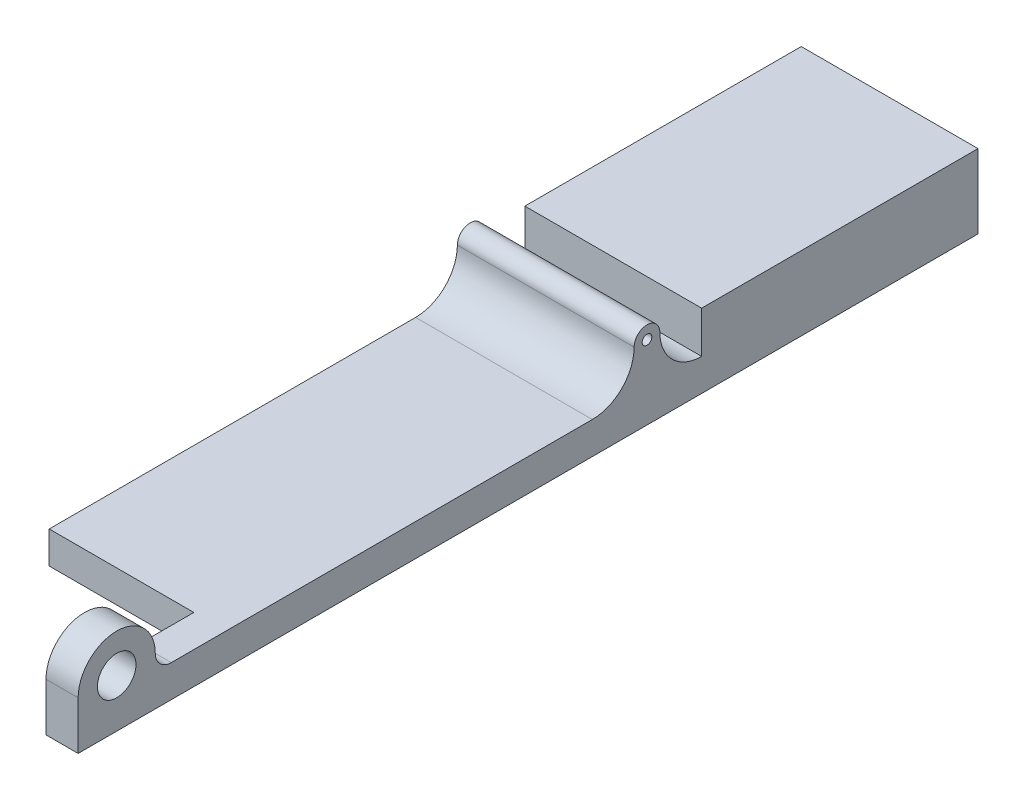
ISO-10303-21;
HEADER;
FILE_DESCRIPTION(('STEP AP214'),'2;1');
FILE_NAME('part.step','',(''),(''),'','','');
FILE_SCHEMA(('AUTOMOTIVE_DESIGN { 1 0 10303 214 1 1 1 1 }'));
ENDSEC;
DATA;
#1=APPLICATION_CONTEXT('core data for automotive mechanical design processes');
#2=APPLICATION_PROTOCOL_DEFINITION('international standard','automotive_design',2000,#1);
#3=PRODUCT_CONTEXT('',#1,'mechanical');
#4=PRODUCT('Part','Part','',(#3));
#5=PRODUCT_RELATED_PRODUCT_CATEGORY('part','',(#4));
#6=PRODUCT_DEFINITION_FORMATION('','',#4);
#7=PRODUCT_DEFINITION_CONTEXT('part definition',#1,'design');
#8=PRODUCT_DEFINITION('design','',#6,#7);
#9=PRODUCT_DEFINITION_SHAPE('','',#8);
#10=(LENGTH_UNIT() NAMED_UNIT(*) SI_UNIT(.MILLI.,.METRE.));
#11=(NAMED_UNIT(*) PLANE_ANGLE_UNIT() SI_UNIT($,.RADIAN.));
#12=(NAMED_UNIT(*) SI_UNIT($,.STERADIAN.) SOLID_ANGLE_UNIT());
#13=UNCERTAINTY_MEASURE_WITH_UNIT(LENGTH_MEASURE(1.E-05),#10,'distance_accuracy_value','');
#14=(GEOMETRIC_REPRESENTATION_CONTEXT(3) GLOBAL_UNCERTAINTY_ASSIGNED_CONTEXT((#13)) GLOBAL_UNIT_ASSIGNED_CONTEXT((#10,
#11,#12)) REPRESENTATION_CONTEXT('',''));
#15=CARTESIAN_POINT('',(0.,0.,0.));
#16=DIRECTION('',(0.,0.,1.));
#17=DIRECTION('',(1.,0.,0.));
#18=AXIS2_PLACEMENT_3D('',#15,#16,#17);
#19=CARTESIAN_POINT('',(55.,23.,-197.));
#20=DIRECTION('',(1.,0.,0.));
#21=DIRECTION('',(0.,0.,-1.));
#22=AXIS2_PLACEMENT_3D('',#19,#20,#21);
#23=PLANE('',#22);
#24=CARTESIAN_POINT('',(55.,15.,-15.));
#25=DIRECTION('',(1.,0.,0.));
#26=DIRECTION('',(0.,0.,-1.));
#27=AXIS2_PLACEMENT_3D('',#24,#25,#26);
#28=CIRCLE('',#27,6.);
#29=CARTESIAN_POINT('',(55.,15.,-21.));
#30=VERTEX_POINT('',#29);
#31=EDGE_CURVE('E152',#30,#30,#28,.T.);
#32=ORIENTED_EDGE('',*,*,#31,.F.);
#33=EDGE_LOOP('',(#32));
#34=FACE_BOUND('',#33,.T.);
#35=CARTESIAN_POINT('',(55.,23.,-197.));
#36=DIRECTION('',(-1.,0.,0.));
#37=DIRECTION('',(0.,0.,-1.));
#38=AXIS2_PLACEMENT_3D('',#35,#36,#37);
#39=CIRCLE('',#38,13.);
#40=CARTESIAN_POINT('',(55.,10.,-197.));
#41=VERTEX_POINT('',#40);
#42=CARTESIAN_POINT('',(55.,23.,-184.));
#43=VERTEX_POINT('',#42);
#44=EDGE_CURVE('E165',#41,#43,#39,.T.);
#45=ORIENTED_EDGE('',*,*,#44,.T.);
#46=CARTESIAN_POINT('',(55.,23.,-180.));
#47=DIRECTION('',(1.,0.,0.));
#48=DIRECTION('',(0.,0.,-1.));
#49=AXIS2_PLACEMENT_3D('',#46,#47,#48);
#50=CIRCLE('',#49,4.);
#51=CARTESIAN_POINT('',(55.,23.,-176.));
#52=VERTEX_POINT('',#51);
#53=EDGE_CURVE('E96',#43,#52,#50,.T.);
#54=ORIENTED_EDGE('',*,*,#53,.T.);
#55=CARTESIAN_POINT('',(55.,23.,-163.));
#56=DIRECTION('',(-1.,0.,0.));
#57=DIRECTION('',(0.,0.,1.));
#58=AXIS2_PLACEMENT_3D('',#55,#56,#57);
#59=CIRCLE('',#58,13.);
#60=CARTESIAN_POINT('',(55.,9.99999999999999,-163.));
#61=VERTEX_POINT('',#60);
#62=EDGE_CURVE('E190',#52,#61,#59,.T.);
#63=ORIENTED_EDGE('',*,*,#62,.T.);
#64=DIRECTION('',(0.,0.,1.));
#65=VECTOR('',#64,1.);
#66=CARTESIAN_POINT('',(55.,10.,-32.));
#67=LINE('',#66,#65);
#68=CARTESIAN_POINT('',(55.,10.,-32.));
#69=VERTEX_POINT('',#68);
#70=EDGE_CURVE('E259',#61,#69,#67,.T.);
#71=ORIENTED_EDGE('',*,*,#70,.T.);
#72=CARTESIAN_POINT('',(55.,15.,-32.));
#73=DIRECTION('',(-1.,0.,0.));
#74=DIRECTION('',(0.,0.,-1.));
#75=AXIS2_PLACEMENT_3D('',#72,#73,#74);
#76=CIRCLE('',#75,5.);
#77=CARTESIAN_POINT('',(55.,15.,-27.));
#78=VERTEX_POINT('',#77);
#79=EDGE_CURVE('E261',#69,#78,#76,.T.);
#80=ORIENTED_EDGE('',*,*,#79,.T.);
#81=CARTESIAN_POINT('',(55.,15.,-15.));
#82=DIRECTION('',(1.,0.,0.));
#83=DIRECTION('',(0.,0.,1.));
#84=AXIS2_PLACEMENT_3D('',#81,#82,#83);
#85=CIRCLE('',#84,12.);
#86=CARTESIAN_POINT('',(55.,15.,-3.));
#87=VERTEX_POINT('',#86);
#88=EDGE_CURVE('E263',#78,#87,#85,.T.);
#89=ORIENTED_EDGE('',*,*,#88,.T.);
#90=DIRECTION('',(0.,-1.,0.));
#91=VECTOR('',#90,1.);
#92=CARTESIAN_POINT('',(55.,15.,-3.));
#93=LINE('',#92,#91);
#94=CARTESIAN_POINT('',(55.,0.,-3.));
#95=VERTEX_POINT('',#94);
#96=EDGE_CURVE('E265',#87,#95,#93,.T.);
#97=ORIENTED_EDGE('',*,*,#96,.T.);
#98=DIRECTION('',(0.,0.,-1.));
#99=VECTOR('',#98,1.);
#100=CARTESIAN_POINT('',(55.,0.,-3.));
#101=LINE('',#100,#99);
#102=CARTESIAN_POINT('',(55.,0.,-283.));
#103=VERTEX_POINT('',#102);
#104=EDGE_CURVE('E127',#95,#103,#101,.T.);
#105=ORIENTED_EDGE('',*,*,#104,.T.);
#106=DIRECTION('',(0.,1.,0.));
#107=VECTOR('',#106,1.);
#108=CARTESIAN_POINT('',(55.,0.,-283.));
#109=LINE('',#108,#107);
#110=CARTESIAN_POINT('',(55.,23.,-283.));
#111=VERTEX_POINT('',#110);
#112=EDGE_CURVE('E120',#103,#111,#109,.T.);
#113=ORIENTED_EDGE('',*,*,#112,.T.);
#114=DIRECTION('',(0.,0.,1.));
#115=VECTOR('',#114,1.);
#116=CARTESIAN_POINT('',(55.,23.,-283.));
#117=LINE('',#116,#115);
#118=CARTESIAN_POINT('',(55.,23.,-197.));
#119=VERTEX_POINT('',#118);
#120=EDGE_CURVE('E124',#111,#119,#117,.T.);
#121=ORIENTED_EDGE('',*,*,#120,.T.);
#122=DIRECTION('',(0.,-1.,0.));
#123=VECTOR('',#122,1.);
#124=CARTESIAN_POINT('',(55.,23.,-197.));
#125=LINE('',#124,#123);
#126=EDGE_CURVE('E58',#119,#41,#125,.T.);
#127=ORIENTED_EDGE('',*,*,#126,.T.);
#128=EDGE_LOOP('',(#45,#54,#63,#71,#80,#89,#97,#105,#113,#121,#127));
#129=FACE_BOUND('',#128,.T.);
#130=CARTESIAN_POINT('',(55.,23.,-180.));
#131=DIRECTION('',(1.,0.,0.));
#132=DIRECTION('',(0.,0.,-1.));
#133=AXIS2_PLACEMENT_3D('',#130,#131,#132);
#134=CIRCLE('',#133,1.5);
#135=CARTESIAN_POINT('',(55.,23.,-181.5));
#136=VERTEX_POINT('',#135);
#137=EDGE_CURVE('E249',#136,#136,#134,.T.);
#138=ORIENTED_EDGE('',*,*,#137,.F.);
#139=EDGE_LOOP('',(#138));
#140=FACE_BOUND('',#139,.T.);
#141=ADVANCED_FACE('F33',(#34,#129,#140),#23,.T.);
#142=CARTESIAN_POINT('',(0.,23.,-197.));
#143=DIRECTION('',(1.,0.,0.));
#144=DIRECTION('',(0.,0.,-1.));
#145=AXIS2_PLACEMENT_3D('',#142,#143,#144);
#146=PLANE('',#145);
#147=DIRECTION('',(0.,0.,-1.));
#148=VECTOR('',#147,1.);
#149=CARTESIAN_POINT('',(0.,0.,-3.));
#150=LINE('',#149,#148);
#151=CARTESIAN_POINT('',(0.,0.,-49.));
#152=VERTEX_POINT('',#151);
#153=CARTESIAN_POINT('',(0.,0.,-283.));
#154=VERTEX_POINT('',#153);
#155=EDGE_CURVE('E159',#152,#154,#150,.T.);
#156=ORIENTED_EDGE('',*,*,#155,.F.);
#157=DIRECTION('',(0.,-1.,0.));
#158=VECTOR('',#157,1.);
#159=CARTESIAN_POINT('',(0.,27.,-49.));
#160=LINE('',#159,#158);
#161=CARTESIAN_POINT('',(0.,10.,-49.));
#162=VERTEX_POINT('',#161);
#163=EDGE_CURVE('E49',#162,#152,#160,.T.);
#164=ORIENTED_EDGE('',*,*,#163,.F.);
#165=DIRECTION('',(0.,0.,1.));
#166=VECTOR('',#165,1.);
#167=CARTESIAN_POINT('',(0.,10.,-32.));
#168=LINE('',#167,#166);
#169=CARTESIAN_POINT('',(0.,9.99999999999999,-163.));
#170=VERTEX_POINT('',#169);
#171=EDGE_CURVE('E156',#170,#162,#168,.T.);
#172=ORIENTED_EDGE('',*,*,#171,.F.);
#173=CARTESIAN_POINT('',(0.,23.,-163.));
#174=DIRECTION('',(-1.,0.,0.));
#175=DIRECTION('',(0.,0.,1.));
#176=AXIS2_PLACEMENT_3D('',#173,#174,#175);
#177=CIRCLE('',#176,13.);
#178=CARTESIAN_POINT('',(0.,23.,-176.));
#179=VERTEX_POINT('',#178);
#180=EDGE_CURVE('E154',#179,#170,#177,.T.);
#181=ORIENTED_EDGE('',*,*,#180,.F.);
#182=CARTESIAN_POINT('',(0.,23.,-180.));
#183=DIRECTION('',(1.,0.,0.));
#184=DIRECTION('',(0.,0.,-1.));
#185=AXIS2_PLACEMENT_3D('',#182,#183,#184);
#186=CIRCLE('',#185,4.);
#187=CARTESIAN_POINT('',(0.,23.,-184.));
#188=VERTEX_POINT('',#187);
#189=EDGE_CURVE('E151',#188,#179,#186,.T.);
#190=ORIENTED_EDGE('',*,*,#189,.F.);
#191=CARTESIAN_POINT('',(0.,23.,-197.));
#192=DIRECTION('',(-1.,0.,0.));
#193=DIRECTION('',(0.,0.,-1.));
#194=AXIS2_PLACEMENT_3D('',#191,#192,#193);
#195=CIRCLE('',#194,13.);
#196=CARTESIAN_POINT('',(0.,10.,-197.));
#197=VERTEX_POINT('',#196);
#198=EDGE_CURVE('E148',#197,#188,#195,.T.);
#199=ORIENTED_EDGE('',*,*,#198,.F.);
#200=DIRECTION('',(0.,-1.,0.));
#201=VECTOR('',#200,1.);
#202=CARTESIAN_POINT('',(0.,23.,-197.));
#203=LINE('',#202,#201);
#204=CARTESIAN_POINT('',(0.,23.,-197.));
#205=VERTEX_POINT('',#204);
#206=EDGE_CURVE('E88',#205,#197,#203,.T.);
#207=ORIENTED_EDGE('',*,*,#206,.F.);
#208=DIRECTION('',(0.,0.,1.));
#209=VECTOR('',#208,1.);
#210=CARTESIAN_POINT('',(0.,23.,-283.));
#211=LINE('',#210,#209);
#212=CARTESIAN_POINT('',(0.,23.,-283.));
#213=VERTEX_POINT('',#212);
#214=EDGE_CURVE('E162',#213,#205,#211,.T.);
#215=ORIENTED_EDGE('',*,*,#214,.F.);
#216=DIRECTION('',(0.,1.,0.));
#217=VECTOR('',#216,1.);
#218=CARTESIAN_POINT('',(0.,0.,-283.));
#219=LINE('',#218,#217);
#220=EDGE_CURVE('E136',#154,#213,#219,.T.);
#221=ORIENTED_EDGE('',*,*,#220,.F.);
#222=EDGE_LOOP('',(#156,#164,#172,#181,#190,#199,#207,#215,#221));
#223=FACE_BOUND('',#222,.T.);
#224=CARTESIAN_POINT('',(0.,23.,-180.));
#225=DIRECTION('',(1.,0.,0.));
#226=DIRECTION('',(0.,0.,-1.));
#227=AXIS2_PLACEMENT_3D('',#224,#225,#226);
#228=CIRCLE('',#227,1.5);
#229=CARTESIAN_POINT('',(0.,23.,-181.5));
#230=VERTEX_POINT('',#229);
#231=EDGE_CURVE('E248',#230,#230,#228,.T.);
#232=ORIENTED_EDGE('',*,*,#231,.T.);
#233=EDGE_LOOP('',(#232));
#234=FACE_BOUND('',#233,.T.);
#235=ADVANCED_FACE('F194',(#223,#234),#146,.F.);
#236=CARTESIAN_POINT('',(55.,23.,-197.));
#237=DIRECTION('',(-1.,0.,0.));
#238=DIRECTION('',(0.,0.,1.));
#239=AXIS2_PLACEMENT_3D('',#236,#237,#238);
#240=CYLINDRICAL_SURFACE('',#239,13.);
#241=ORIENTED_EDGE('',*,*,#198,.T.);
#242=DIRECTION('',(-1.,0.,0.));
#243=VECTOR('',#242,1.);
#244=CARTESIAN_POINT('',(55.,23.,-184.));
#245=LINE('',#244,#243);
#246=EDGE_CURVE('E11',#43,#188,#245,.T.);
#247=ORIENTED_EDGE('',*,*,#246,.F.);
#248=ORIENTED_EDGE('',*,*,#44,.F.);
#249=DIRECTION('',(-1.,0.,0.));
#250=VECTOR('',#249,1.);
#251=CARTESIAN_POINT('',(55.,10.,-197.));
#252=LINE('',#251,#250);
#253=EDGE_CURVE('E144',#41,#197,#252,.T.);
#254=ORIENTED_EDGE('',*,*,#253,.T.);
#255=EDGE_LOOP('',(#241,#247,#248,#254));
#256=FACE_BOUND('',#255,.T.);
#257=ADVANCED_FACE('F35',(#256),#240,.F.);
#258=CARTESIAN_POINT('',(55.,23.,-180.));
#259=DIRECTION('',(-1.,0.,0.));
#260=DIRECTION('',(0.,0.,1.));
#261=AXIS2_PLACEMENT_3D('',#258,#259,#260);
#262=CYLINDRICAL_SURFACE('',#261,4.);
#263=ORIENTED_EDGE('',*,*,#189,.T.);
#264=DIRECTION('',(-1.,0.,0.));
#265=VECTOR('',#264,1.);
#266=CARTESIAN_POINT('',(55.,23.,-176.));
#267=LINE('',#266,#265);
#268=EDGE_CURVE('E42',#52,#179,#267,.T.);
#269=ORIENTED_EDGE('',*,*,#268,.F.);
#270=ORIENTED_EDGE('',*,*,#53,.F.);
#271=ORIENTED_EDGE('',*,*,#246,.T.);
#272=EDGE_LOOP('',(#263,#269,#270,#271));
#273=FACE_BOUND('',#272,.T.);
#274=ADVANCED_FACE('F409',(#273),#262,.T.);
#275=CARTESIAN_POINT('',(55.,23.,-163.));
#276=DIRECTION('',(-1.,0.,0.));
#277=DIRECTION('',(0.,0.,1.));
#278=AXIS2_PLACEMENT_3D('',#275,#276,#277);
#279=CYLINDRICAL_SURFACE('',#278,13.);
#280=ORIENTED_EDGE('',*,*,#180,.T.);
#281=DIRECTION('',(-1.,0.,0.));
#282=VECTOR('',#281,1.);
#283=CARTESIAN_POINT('',(55.,9.99999999999999,-163.));
#284=LINE('',#283,#282);
#285=EDGE_CURVE('E181',#61,#170,#284,.T.);
#286=ORIENTED_EDGE('',*,*,#285,.F.);
#287=ORIENTED_EDGE('',*,*,#62,.F.);
#288=ORIENTED_EDGE('',*,*,#268,.T.);
#289=EDGE_LOOP('',(#280,#286,#287,#288));
#290=FACE_BOUND('',#289,.T.);
#291=ADVANCED_FACE('F188',(#290),#279,.F.);
#292=CARTESIAN_POINT('',(55.,10.,-32.));
#293=DIRECTION('',(0.,-1.,0.));
#294=DIRECTION('',(0.,0.,-1.));
#295=AXIS2_PLACEMENT_3D('',#292,#293,#294);
#296=PLANE('',#295);
#297=DIRECTION('',(1.,0.,0.));
#298=VECTOR('',#297,1.);
#299=CARTESIAN_POINT('',(55.,10.,-49.));
#300=LINE('',#299,#298);
#301=CARTESIAN_POINT('',(45.,10.,-49.));
#302=VERTEX_POINT('',#301);
#303=EDGE_CURVE('E202',#162,#302,#300,.T.);
#304=ORIENTED_EDGE('',*,*,#303,.T.);
#305=DIRECTION('',(0.,0.,1.));
#306=VECTOR('',#305,1.);
#307=CARTESIAN_POINT('',(45.,10.,-32.));
#308=LINE('',#307,#306);
#309=CARTESIAN_POINT('',(45.,9.99999999999999,-32.));
#310=VERTEX_POINT('',#309);
#311=EDGE_CURVE('E230',#302,#310,#308,.T.);
#312=ORIENTED_EDGE('',*,*,#311,.T.);
#313=DIRECTION('',(-1.,0.,0.));
#314=VECTOR('',#313,1.);
#315=CARTESIAN_POINT('',(55.,10.,-32.));
#316=LINE('',#315,#314);
#317=EDGE_CURVE('E178',#69,#310,#316,.T.);
#318=ORIENTED_EDGE('',*,*,#317,.F.);
#319=ORIENTED_EDGE('',*,*,#70,.F.);
#320=ORIENTED_EDGE('',*,*,#285,.T.);
#321=ORIENTED_EDGE('',*,*,#171,.T.);
#322=EDGE_LOOP('',(#304,#312,#318,#319,#320,#321));
#323=FACE_BOUND('',#322,.T.);
#324=ADVANCED_FACE('F199',(#323),#296,.F.);
#325=CARTESIAN_POINT('',(55.,15.,-32.));
#326=DIRECTION('',(-1.,0.,0.));
#327=DIRECTION('',(0.,0.,1.));
#328=AXIS2_PLACEMENT_3D('',#325,#326,#327);
#329=CYLINDRICAL_SURFACE('',#328,5.);
#330=ORIENTED_EDGE('',*,*,#317,.T.);
#331=CARTESIAN_POINT('',(45.,15.,-32.));
#332=DIRECTION('',(1.,0.,0.));
#333=DIRECTION('',(0.,0.,-1.));
#334=AXIS2_PLACEMENT_3D('',#331,#332,#333);
#335=CIRCLE('',#334,5.);
#336=CARTESIAN_POINT('',(45.,15.,-27.));
#337=VERTEX_POINT('',#336);
#338=EDGE_CURVE('E212',#310,#337,#335,.F.);
#339=ORIENTED_EDGE('',*,*,#338,.T.);
#340=DIRECTION('',(-1.,0.,0.));
#341=VECTOR('',#340,1.);
#342=CARTESIAN_POINT('',(55.,15.,-27.));
#343=LINE('',#342,#341);
#344=EDGE_CURVE('E175',#78,#337,#343,.T.);
#345=ORIENTED_EDGE('',*,*,#344,.F.);
#346=ORIENTED_EDGE('',*,*,#79,.F.);
#347=EDGE_LOOP('',(#330,#339,#345,#346));
#348=FACE_BOUND('',#347,.T.);
#349=ADVANCED_FACE('F279',(#348),#329,.F.);
#350=CARTESIAN_POINT('',(55.,15.,-15.));
#351=DIRECTION('',(-1.,0.,0.));
#352=DIRECTION('',(0.,0.,1.));
#353=AXIS2_PLACEMENT_3D('',#350,#351,#352);
#354=CYLINDRICAL_SURFACE('',#353,12.);
#355=CARTESIAN_POINT('',(45.,15.,-15.));
#356=DIRECTION('',(1.,0.,0.));
#357=DIRECTION('',(0.,0.,-1.));
#358=AXIS2_PLACEMENT_3D('',#355,#356,#357);
#359=CIRCLE('',#358,12.);
#360=CARTESIAN_POINT('',(45.,15.,-3.));
#361=VERTEX_POINT('',#360);
#362=EDGE_CURVE('E243',#337,#361,#359,.T.);
#363=ORIENTED_EDGE('',*,*,#362,.T.);
#364=DIRECTION('',(-1.,0.,0.));
#365=VECTOR('',#364,1.);
#366=CARTESIAN_POINT('',(55.,15.,-3.));
#367=LINE('',#366,#365);
#368=EDGE_CURVE('E172',#87,#361,#367,.T.);
#369=ORIENTED_EDGE('',*,*,#368,.F.);
#370=ORIENTED_EDGE('',*,*,#88,.F.);
#371=ORIENTED_EDGE('',*,*,#344,.T.);
#372=EDGE_LOOP('',(#363,#369,#370,#371));
#373=FACE_BOUND('',#372,.T.);
#374=ADVANCED_FACE('F281',(#373),#354,.T.);
#375=CARTESIAN_POINT('',(55.,15.,-3.));
#376=DIRECTION('',(0.,0.,-1.));
#377=DIRECTION('',(-1.,0.,0.));
#378=AXIS2_PLACEMENT_3D('',#375,#376,#377);
#379=PLANE('',#378);
#380=ORIENTED_EDGE('',*,*,#368,.T.);
#381=DIRECTION('',(0.,-1.,0.));
#382=VECTOR('',#381,1.);
#383=CARTESIAN_POINT('',(45.,27.,-3.));
#384=LINE('',#383,#382);
#385=CARTESIAN_POINT('',(45.,0.,-3.));
#386=VERTEX_POINT('',#385);
#387=EDGE_CURVE('E231',#361,#386,#384,.T.);
#388=ORIENTED_EDGE('',*,*,#387,.T.);
#389=DIRECTION('',(-1.,0.,0.));
#390=VECTOR('',#389,1.);
#391=CARTESIAN_POINT('',(55.,0.,-3.));
#392=LINE('',#391,#390);
#393=EDGE_CURVE('E169',#95,#386,#392,.T.);
#394=ORIENTED_EDGE('',*,*,#393,.F.);
#395=ORIENTED_EDGE('',*,*,#96,.F.);
#396=EDGE_LOOP('',(#380,#388,#394,#395));
#397=FACE_BOUND('',#396,.T.);
#398=ADVANCED_FACE('F270',(#397),#379,.F.);
#399=CARTESIAN_POINT('',(55.,0.,-3.));
#400=DIRECTION('',(0.,1.,0.));
#401=DIRECTION('',(0.,0.,1.));
#402=AXIS2_PLACEMENT_3D('',#399,#400,#401);
#403=PLANE('',#402);
#404=ORIENTED_EDGE('',*,*,#393,.T.);
#405=DIRECTION('',(0.,0.,1.));
#406=VECTOR('',#405,1.);
#407=CARTESIAN_POINT('',(45.,0.,-3.));
#408=LINE('',#407,#406);
#409=CARTESIAN_POINT('',(45.,0.,-49.));
#410=VERTEX_POINT('',#409);
#411=EDGE_CURVE('E228',#410,#386,#408,.T.);
#412=ORIENTED_EDGE('',*,*,#411,.F.);
#413=DIRECTION('',(1.,0.,0.));
#414=VECTOR('',#413,1.);
#415=CARTESIAN_POINT('',(0.,0.,-49.));
#416=LINE('',#415,#414);
#417=EDGE_CURVE('E233',#152,#410,#416,.T.);
#418=ORIENTED_EDGE('',*,*,#417,.F.);
#419=ORIENTED_EDGE('',*,*,#155,.T.);
#420=DIRECTION('',(-1.,0.,0.));
#421=VECTOR('',#420,1.);
#422=CARTESIAN_POINT('',(55.,0.,-283.));
#423=LINE('',#422,#421);
#424=EDGE_CURVE('E139',#103,#154,#423,.T.);
#425=ORIENTED_EDGE('',*,*,#424,.F.);
#426=ORIENTED_EDGE('',*,*,#104,.F.);
#427=EDGE_LOOP('',(#404,#412,#418,#419,#425,#426));
#428=FACE_BOUND('',#427,.T.);
#429=ADVANCED_FACE('F237',(#428),#403,.F.);
#430=CARTESIAN_POINT('',(55.,0.,-283.));
#431=DIRECTION('',(0.,0.,1.));
#432=DIRECTION('',(1.,0.,0.));
#433=AXIS2_PLACEMENT_3D('',#430,#431,#432);
#434=PLANE('',#433);
#435=ORIENTED_EDGE('',*,*,#220,.T.);
#436=DIRECTION('',(-1.,0.,0.));
#437=VECTOR('',#436,1.);
#438=CARTESIAN_POINT('',(55.,23.,-283.));
#439=LINE('',#438,#437);
#440=EDGE_CURVE('E133',#111,#213,#439,.T.);
#441=ORIENTED_EDGE('',*,*,#440,.F.);
#442=ORIENTED_EDGE('',*,*,#112,.F.);
#443=ORIENTED_EDGE('',*,*,#424,.T.);
#444=EDGE_LOOP('',(#435,#441,#442,#443));
#445=FACE_BOUND('',#444,.T.);
#446=ADVANCED_FACE('F134',(#445),#434,.F.);
#447=CARTESIAN_POINT('',(55.,23.,-283.));
#448=DIRECTION('',(0.,-1.,0.));
#449=DIRECTION('',(0.,0.,-1.));
#450=AXIS2_PLACEMENT_3D('',#447,#448,#449);
#451=PLANE('',#450);
#452=ORIENTED_EDGE('',*,*,#214,.T.);
#453=DIRECTION('',(-1.,0.,0.));
#454=VECTOR('',#453,1.);
#455=CARTESIAN_POINT('',(55.,23.,-197.));
#456=LINE('',#455,#454);
#457=EDGE_CURVE('E140',#119,#205,#456,.T.);
#458=ORIENTED_EDGE('',*,*,#457,.F.);
#459=ORIENTED_EDGE('',*,*,#120,.F.);
#460=ORIENTED_EDGE('',*,*,#440,.T.);
#461=EDGE_LOOP('',(#452,#458,#459,#460));
#462=FACE_BOUND('',#461,.T.);
#463=ADVANCED_FACE('F142',(#462),#451,.F.);
#464=CARTESIAN_POINT('',(55.,23.,-197.));
#465=DIRECTION('',(0.,0.,-1.));
#466=DIRECTION('',(-1.,0.,0.));
#467=AXIS2_PLACEMENT_3D('',#464,#465,#466);
#468=PLANE('',#467);
#469=ORIENTED_EDGE('',*,*,#206,.T.);
#470=ORIENTED_EDGE('',*,*,#253,.F.);
#471=ORIENTED_EDGE('',*,*,#126,.F.);
#472=ORIENTED_EDGE('',*,*,#457,.T.);
#473=EDGE_LOOP('',(#469,#470,#471,#472));
#474=FACE_BOUND('',#473,.T.);
#475=ADVANCED_FACE('F271',(#474),#468,.F.);
#476=CARTESIAN_POINT('',(55.,15.,-15.));
#477=DIRECTION('',(-1.,0.,0.));
#478=DIRECTION('',(0.,0.,1.));
#479=AXIS2_PLACEMENT_3D('',#476,#477,#478);
#480=CYLINDRICAL_SURFACE('',#479,6.);
#481=CARTESIAN_POINT('',(45.,15.,-15.));
#482=DIRECTION('',(1.,0.,0.));
#483=DIRECTION('',(0.,0.,-1.));
#484=AXIS2_PLACEMENT_3D('',#481,#482,#483);
#485=CIRCLE('',#484,6.);
#486=CARTESIAN_POINT('',(45.,15.,-21.));
#487=VERTEX_POINT('',#486);
#488=EDGE_CURVE('E37',#487,#487,#485,.T.);
#489=ORIENTED_EDGE('',*,*,#488,.F.);
#490=EDGE_LOOP('',(#489));
#491=FACE_BOUND('',#490,.T.);
#492=ORIENTED_EDGE('',*,*,#31,.T.);
#493=EDGE_LOOP('',(#492));
#494=FACE_BOUND('',#493,.T.);
#495=ADVANCED_FACE('F299',(#491,#494),#480,.F.);
#496=CARTESIAN_POINT('',(55.,23.,-180.));
#497=DIRECTION('',(-1.,0.,0.));
#498=DIRECTION('',(0.,0.,1.));
#499=AXIS2_PLACEMENT_3D('',#496,#497,#498);
#500=CYLINDRICAL_SURFACE('',#499,1.5);
#501=ORIENTED_EDGE('',*,*,#137,.T.);
#502=EDGE_LOOP('',(#501));
#503=FACE_BOUND('',#502,.T.);
#504=ORIENTED_EDGE('',*,*,#231,.F.);
#505=EDGE_LOOP('',(#504));
#506=FACE_BOUND('',#505,.T.);
#507=ADVANCED_FACE('F333',(#503,#506),#500,.F.);
#508=CARTESIAN_POINT('',(0.,27.,-49.));
#509=DIRECTION('',(0.,0.,-1.));
#510=DIRECTION('',(-1.,0.,0.));
#511=AXIS2_PLACEMENT_3D('',#508,#509,#510);
#512=PLANE('',#511);
#513=ORIENTED_EDGE('',*,*,#163,.T.);
#514=ORIENTED_EDGE('',*,*,#417,.T.);
#515=DIRECTION('',(0.,-1.,0.));
#516=VECTOR('',#515,1.);
#517=CARTESIAN_POINT('',(45.,27.,-49.));
#518=LINE('',#517,#516);
#519=EDGE_CURVE('E224',#302,#410,#518,.T.);
#520=ORIENTED_EDGE('',*,*,#519,.F.);
#521=ORIENTED_EDGE('',*,*,#303,.F.);
#522=EDGE_LOOP('',(#513,#514,#520,#521));
#523=FACE_BOUND('',#522,.T.);
#524=ADVANCED_FACE('F234',(#523),#512,.F.);
#525=CARTESIAN_POINT('',(45.,27.,-3.));
#526=DIRECTION('',(1.,0.,0.));
#527=DIRECTION('',(0.,0.,-1.));
#528=AXIS2_PLACEMENT_3D('',#525,#526,#527);
#529=PLANE('',#528);
#530=ORIENTED_EDGE('',*,*,#488,.T.);
#531=EDGE_LOOP('',(#530));
#532=FACE_BOUND('',#531,.T.);
#533=ORIENTED_EDGE('',*,*,#519,.T.);
#534=ORIENTED_EDGE('',*,*,#411,.T.);
#535=ORIENTED_EDGE('',*,*,#387,.F.);
#536=ORIENTED_EDGE('',*,*,#362,.F.);
#537=ORIENTED_EDGE('',*,*,#338,.F.);
#538=ORIENTED_EDGE('',*,*,#311,.F.);
#539=EDGE_LOOP('',(#533,#534,#535,#536,#537,#538));
#540=FACE_BOUND('',#539,.T.);
#541=ADVANCED_FACE('F225',(#532,#540),#529,.F.);
#542=CLOSED_SHELL('',(#141,#235,#257,#274,#291,#324,#349,#374,#398,#429,#446,#463,#475,#495,
#507,#524,#541));
#543=MANIFOLD_SOLID_BREP('B2',#542);
#544=ADVANCED_BREP_SHAPE_REPRESENTATION('',(#18,#543),#14);
#545=SHAPE_DEFINITION_REPRESENTATION(#9,#544);
ENDSEC;
END-ISO-10303-21;
